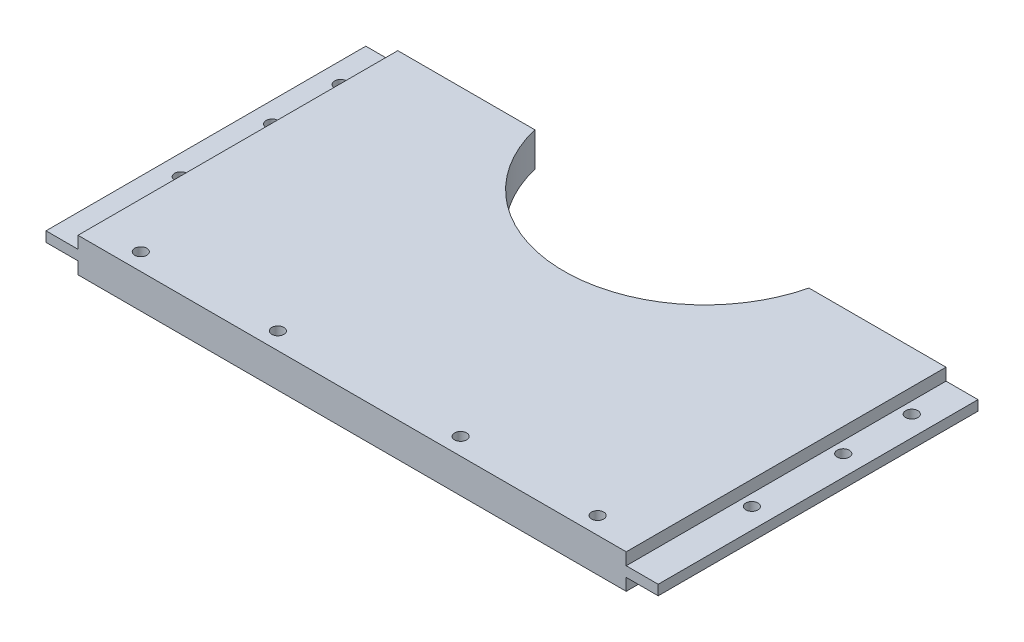
ISO-10303-21;
HEADER;
FILE_DESCRIPTION(('STEP AP214'),'2;1');
FILE_NAME('part.step','',(''),(''),'','','');
FILE_SCHEMA(('AUTOMOTIVE_DESIGN { 1 0 10303 214 1 1 1 1 }'));
ENDSEC;
DATA;
#1=APPLICATION_CONTEXT('core data for automotive mechanical design processes');
#2=APPLICATION_PROTOCOL_DEFINITION('international standard','automotive_design',2000,#1);
#3=PRODUCT_CONTEXT('',#1,'mechanical');
#4=PRODUCT('Part','Part','',(#3));
#5=PRODUCT_RELATED_PRODUCT_CATEGORY('part','',(#4));
#6=PRODUCT_DEFINITION_FORMATION('','',#4);
#7=PRODUCT_DEFINITION_CONTEXT('part definition',#1,'design');
#8=PRODUCT_DEFINITION('design','',#6,#7);
#9=PRODUCT_DEFINITION_SHAPE('','',#8);
#10=(LENGTH_UNIT() NAMED_UNIT(*) SI_UNIT(.MILLI.,.METRE.));
#11=(NAMED_UNIT(*) PLANE_ANGLE_UNIT() SI_UNIT($,.RADIAN.));
#12=(NAMED_UNIT(*) SI_UNIT($,.STERADIAN.) SOLID_ANGLE_UNIT());
#13=UNCERTAINTY_MEASURE_WITH_UNIT(LENGTH_MEASURE(1.E-05),#10,'distance_accuracy_value','');
#14=(GEOMETRIC_REPRESENTATION_CONTEXT(3) GLOBAL_UNCERTAINTY_ASSIGNED_CONTEXT((#13)) GLOBAL_UNIT_ASSIGNED_CONTEXT((#10,
#11,#12)) REPRESENTATION_CONTEXT('',''));
#15=CARTESIAN_POINT('',(0.,0.,0.));
#16=DIRECTION('',(0.,0.,1.));
#17=DIRECTION('',(1.,0.,0.));
#18=AXIS2_PLACEMENT_3D('',#15,#16,#17);
#19=CARTESIAN_POINT('',(152.4,9.525,0.));
#20=DIRECTION('',(-1.,0.,0.));
#21=DIRECTION('',(0.,0.,1.));
#22=AXIS2_PLACEMENT_3D('',#19,#20,#21);
#23=PLANE('',#22);
#24=DIRECTION('',(0.,0.,1.));
#25=VECTOR('',#24,1.);
#26=CARTESIAN_POINT('',(152.4,2.794,-88.9));
#27=LINE('',#26,#25);
#28=CARTESIAN_POINT('',(152.4,2.794,-88.9));
#29=VERTEX_POINT('',#28);
#30=CARTESIAN_POINT('',(152.4,2.794,88.8999999999999));
#31=VERTEX_POINT('',#30);
#32=EDGE_CURVE('E142',#29,#31,#27,.T.);
#33=ORIENTED_EDGE('',*,*,#32,.F.);
#34=DIRECTION('',(0.,-1.,0.));
#35=VECTOR('',#34,1.);
#36=CARTESIAN_POINT('',(152.4,9.525,-88.9));
#37=LINE('',#36,#35);
#38=CARTESIAN_POINT('',(152.4,9.525,-88.9));
#39=VERTEX_POINT('',#38);
#40=EDGE_CURVE('E272',#39,#29,#37,.T.);
#41=ORIENTED_EDGE('',*,*,#40,.F.);
#42=DIRECTION('',(0.,0.,-1.));
#43=VECTOR('',#42,1.);
#44=CARTESIAN_POINT('',(152.4,9.525,0.));
#45=LINE('',#44,#43);
#46=CARTESIAN_POINT('',(152.4,9.525,88.9));
#47=VERTEX_POINT('',#46);
#48=EDGE_CURVE('E144',#47,#39,#45,.T.);
#49=ORIENTED_EDGE('',*,*,#48,.F.);
#50=DIRECTION('',(0.,-1.,0.));
#51=VECTOR('',#50,1.);
#52=CARTESIAN_POINT('',(152.4,9.525,88.9));
#53=LINE('',#52,#51);
#54=EDGE_CURVE('E138',#47,#31,#53,.T.);
#55=ORIENTED_EDGE('',*,*,#54,.T.);
#56=EDGE_LOOP('',(#33,#41,#49,#55));
#57=FACE_BOUND('',#56,.T.);
#58=ADVANCED_FACE('F38',(#57),#23,.F.);
#59=CARTESIAN_POINT('',(-152.4,9.525,0.));
#60=DIRECTION('',(1.,0.,0.));
#61=DIRECTION('',(0.,0.,-1.));
#62=AXIS2_PLACEMENT_3D('',#59,#60,#61);
#63=PLANE('',#62);
#64=DIRECTION('',(0.,0.,-1.));
#65=VECTOR('',#64,1.);
#66=CARTESIAN_POINT('',(-152.4,2.794,-88.9));
#67=LINE('',#66,#65);
#68=CARTESIAN_POINT('',(-152.4,2.794,88.9));
#69=VERTEX_POINT('',#68);
#70=CARTESIAN_POINT('',(-152.4,2.794,-88.9));
#71=VERTEX_POINT('',#70);
#72=EDGE_CURVE('E194',#69,#71,#67,.T.);
#73=ORIENTED_EDGE('',*,*,#72,.F.);
#74=DIRECTION('',(0.,-1.,0.));
#75=VECTOR('',#74,1.);
#76=CARTESIAN_POINT('',(-152.4,9.525,88.9));
#77=LINE('',#76,#75);
#78=CARTESIAN_POINT('',(-152.4,9.525,88.9));
#79=VERTEX_POINT('',#78);
#80=EDGE_CURVE('E275',#79,#69,#77,.T.);
#81=ORIENTED_EDGE('',*,*,#80,.F.);
#82=DIRECTION('',(0.,0.,1.));
#83=VECTOR('',#82,1.);
#84=CARTESIAN_POINT('',(-152.4,9.525,0.));
#85=LINE('',#84,#83);
#86=CARTESIAN_POINT('',(-152.4,9.525,-88.9));
#87=VERTEX_POINT('',#86);
#88=EDGE_CURVE('E238',#87,#79,#85,.T.);
#89=ORIENTED_EDGE('',*,*,#88,.F.);
#90=DIRECTION('',(0.,-1.,0.));
#91=VECTOR('',#90,1.);
#92=CARTESIAN_POINT('',(-152.4,9.525,-88.9));
#93=LINE('',#92,#91);
#94=EDGE_CURVE('E47',#87,#71,#93,.T.);
#95=ORIENTED_EDGE('',*,*,#94,.T.);
#96=EDGE_LOOP('',(#73,#81,#89,#95));
#97=FACE_BOUND('',#96,.T.);
#98=ADVANCED_FACE('F325',(#97),#63,.F.);
#99=CARTESIAN_POINT('',(0.,9.525,-107.26510662425));
#100=DIRECTION('',(0.,-1.,0.));
#101=DIRECTION('',(0.,0.,-1.));
#102=AXIS2_PLACEMENT_3D('',#99,#100,#101);
#103=CYLINDRICAL_SURFACE('',#102,78.3818674268486);
#104=CARTESIAN_POINT('',(0.,-9.525,-107.26510662425));
#105=DIRECTION('',(0.,1.,0.));
#106=DIRECTION('',(0.,0.,1.));
#107=AXIS2_PLACEMENT_3D('',#104,#105,#106);
#108=CIRCLE('',#107,78.3818674268486);
#109=CARTESIAN_POINT('',(-76.2,-9.525,-88.9));
#110=VERTEX_POINT('',#109);
#111=CARTESIAN_POINT('',(76.2,-9.525,-88.9));
#112=VERTEX_POINT('',#111);
#113=EDGE_CURVE('E228',#110,#112,#108,.T.);
#114=ORIENTED_EDGE('',*,*,#113,.F.);
#115=DIRECTION('',(0.,-1.,0.));
#116=VECTOR('',#115,1.);
#117=CARTESIAN_POINT('',(-76.2,9.525,-88.9));
#118=LINE('',#117,#116);
#119=CARTESIAN_POINT('',(-76.2,9.525,-88.9));
#120=VERTEX_POINT('',#119);
#121=EDGE_CURVE('E11',#120,#110,#118,.T.);
#122=ORIENTED_EDGE('',*,*,#121,.F.);
#123=CARTESIAN_POINT('',(0.,9.525,-107.26510662425));
#124=DIRECTION('',(0.,1.,0.));
#125=DIRECTION('',(0.,0.,1.));
#126=AXIS2_PLACEMENT_3D('',#123,#124,#125);
#127=CIRCLE('',#126,78.3818674268486);
#128=CARTESIAN_POINT('',(76.2,9.525,-88.9));
#129=VERTEX_POINT('',#128);
#130=EDGE_CURVE('E229',#120,#129,#127,.T.);
#131=ORIENTED_EDGE('',*,*,#130,.T.);
#132=DIRECTION('',(0.,-1.,0.));
#133=VECTOR('',#132,1.);
#134=CARTESIAN_POINT('',(76.2,9.525,-88.9));
#135=LINE('',#134,#133);
#136=EDGE_CURVE('E249',#129,#112,#135,.T.);
#137=ORIENTED_EDGE('',*,*,#136,.T.);
#138=EDGE_LOOP('',(#114,#122,#131,#137));
#139=FACE_BOUND('',#138,.T.);
#140=ADVANCED_FACE('F40',(#139),#103,.F.);
#141=CARTESIAN_POINT('',(0.,9.525,-88.9));
#142=DIRECTION('',(0.,0.,-1.));
#143=DIRECTION('',(-1.,0.,0.));
#144=AXIS2_PLACEMENT_3D('',#141,#142,#143);
#145=PLANE('',#144);
#146=DIRECTION('',(1.,0.,0.));
#147=VECTOR('',#146,1.);
#148=CARTESIAN_POINT('',(0.,-9.525,-88.9));
#149=LINE('',#148,#147);
#150=CARTESIAN_POINT('',(-152.4,-9.525,-88.9));
#151=VERTEX_POINT('',#150);
#152=EDGE_CURVE('E253',#151,#110,#149,.T.);
#153=ORIENTED_EDGE('',*,*,#152,.F.);
#154=CARTESIAN_POINT('',(-152.4,-2.794,-88.9));
#155=VERTEX_POINT('',#154);
#156=EDGE_CURVE('E278',#155,#151,#93,.T.);
#157=ORIENTED_EDGE('',*,*,#156,.F.);
#158=DIRECTION('',(-1.,0.,0.));
#159=VECTOR('',#158,1.);
#160=CARTESIAN_POINT('',(-152.4,-2.794,-88.9));
#161=LINE('',#160,#159);
#162=CARTESIAN_POINT('',(-170.18,-2.794,-88.9));
#163=VERTEX_POINT('',#162);
#164=EDGE_CURVE('E212',#155,#163,#161,.T.);
#165=ORIENTED_EDGE('',*,*,#164,.T.);
#166=DIRECTION('',(0.,-1.,0.));
#167=VECTOR('',#166,1.);
#168=CARTESIAN_POINT('',(-170.18,2.794,-88.9));
#169=LINE('',#168,#167);
#170=CARTESIAN_POINT('',(-170.18,2.794,-88.9));
#171=VERTEX_POINT('',#170);
#172=EDGE_CURVE('E224',#171,#163,#169,.T.);
#173=ORIENTED_EDGE('',*,*,#172,.F.);
#174=DIRECTION('',(-1.,0.,0.));
#175=VECTOR('',#174,1.);
#176=CARTESIAN_POINT('',(-152.4,2.794,-88.9));
#177=LINE('',#176,#175);
#178=EDGE_CURVE('E198',#71,#171,#177,.T.);
#179=ORIENTED_EDGE('',*,*,#178,.F.);
#180=ORIENTED_EDGE('',*,*,#94,.F.);
#181=DIRECTION('',(1.,0.,0.));
#182=VECTOR('',#181,1.);
#183=CARTESIAN_POINT('',(0.,9.525,-88.9));
#184=LINE('',#183,#182);
#185=EDGE_CURVE('E233',#87,#120,#184,.T.);
#186=ORIENTED_EDGE('',*,*,#185,.T.);
#187=ORIENTED_EDGE('',*,*,#121,.T.);
#188=EDGE_LOOP('',(#153,#157,#165,#173,#179,#180,#186,#187));
#189=FACE_BOUND('',#188,.T.);
#190=ADVANCED_FACE('F296',(#189),#145,.T.);
#191=CARTESIAN_POINT('',(-152.4,-2.794,88.9));
#192=VERTEX_POINT('',#191);
#193=CARTESIAN_POINT('',(-152.4,-9.525,88.9));
#194=VERTEX_POINT('',#193);
#195=EDGE_CURVE('E148',#192,#194,#77,.T.);
#196=ORIENTED_EDGE('',*,*,#195,.F.);
#197=DIRECTION('',(0.,0.,-1.));
#198=VECTOR('',#197,1.);
#199=CARTESIAN_POINT('',(-152.4,-2.794,-88.9));
#200=LINE('',#199,#198);
#201=EDGE_CURVE('E193',#192,#155,#200,.T.);
#202=ORIENTED_EDGE('',*,*,#201,.T.);
#203=ORIENTED_EDGE('',*,*,#156,.T.);
#204=DIRECTION('',(0.,0.,1.));
#205=VECTOR('',#204,1.);
#206=CARTESIAN_POINT('',(-152.4,-9.525,0.));
#207=LINE('',#206,#205);
#208=EDGE_CURVE('E257',#151,#194,#207,.T.);
#209=ORIENTED_EDGE('',*,*,#208,.T.);
#210=EDGE_LOOP('',(#196,#202,#203,#209));
#211=FACE_BOUND('',#210,.T.);
#212=ADVANCED_FACE('F287',(#211),#63,.F.);
#213=CARTESIAN_POINT('',(0.,9.525,88.9));
#214=DIRECTION('',(0.,0.,-1.));
#215=DIRECTION('',(-1.,0.,0.));
#216=AXIS2_PLACEMENT_3D('',#213,#214,#215);
#217=PLANE('',#216);
#218=DIRECTION('',(1.,0.,0.));
#219=VECTOR('',#218,1.);
#220=CARTESIAN_POINT('',(0.,-9.525,88.9));
#221=LINE('',#220,#219);
#222=CARTESIAN_POINT('',(152.4,-9.525,88.9));
#223=VERTEX_POINT('',#222);
#224=EDGE_CURVE('E261',#194,#223,#221,.T.);
#225=ORIENTED_EDGE('',*,*,#224,.T.);
#226=CARTESIAN_POINT('',(152.4,-2.794,88.9));
#227=VERTEX_POINT('',#226);
#228=EDGE_CURVE('E149',#227,#223,#53,.T.);
#229=ORIENTED_EDGE('',*,*,#228,.F.);
#230=DIRECTION('',(1.,0.,0.));
#231=VECTOR('',#230,1.);
#232=CARTESIAN_POINT('',(152.4,-2.794,88.8999999999999));
#233=LINE('',#232,#231);
#234=CARTESIAN_POINT('',(170.18,-2.794,88.8999999999999));
#235=VERTEX_POINT('',#234);
#236=EDGE_CURVE('E183',#227,#235,#233,.T.);
#237=ORIENTED_EDGE('',*,*,#236,.T.);
#238=DIRECTION('',(0.,-1.,0.));
#239=VECTOR('',#238,1.);
#240=CARTESIAN_POINT('',(170.18,2.794,88.8999999999999));
#241=LINE('',#240,#239);
#242=CARTESIAN_POINT('',(170.18,2.794,88.8999999999999));
#243=VERTEX_POINT('',#242);
#244=EDGE_CURVE('E156',#243,#235,#241,.T.);
#245=ORIENTED_EDGE('',*,*,#244,.F.);
#246=DIRECTION('',(1.,0.,0.));
#247=VECTOR('',#246,1.);
#248=CARTESIAN_POINT('',(152.4,2.794,88.8999999999999));
#249=LINE('',#248,#247);
#250=EDGE_CURVE('E152',#31,#243,#249,.T.);
#251=ORIENTED_EDGE('',*,*,#250,.F.);
#252=ORIENTED_EDGE('',*,*,#54,.F.);
#253=DIRECTION('',(1.,0.,0.));
#254=VECTOR('',#253,1.);
#255=CARTESIAN_POINT('',(0.,9.525,88.9));
#256=LINE('',#255,#254);
#257=EDGE_CURVE('E241',#79,#47,#256,.T.);
#258=ORIENTED_EDGE('',*,*,#257,.F.);
#259=ORIENTED_EDGE('',*,*,#80,.T.);
#260=DIRECTION('',(1.,0.,0.));
#261=VECTOR('',#260,1.);
#262=CARTESIAN_POINT('',(-152.4,2.794,88.9));
#263=LINE('',#262,#261);
#264=CARTESIAN_POINT('',(-170.18,2.794,88.9));
#265=VERTEX_POINT('',#264);
#266=EDGE_CURVE('E205',#265,#69,#263,.T.);
#267=ORIENTED_EDGE('',*,*,#266,.F.);
#268=DIRECTION('',(0.,-1.,0.));
#269=VECTOR('',#268,1.);
#270=CARTESIAN_POINT('',(-170.18,2.794,88.9));
#271=LINE('',#270,#269);
#272=CARTESIAN_POINT('',(-170.18,-2.794,88.9));
#273=VERTEX_POINT('',#272);
#274=EDGE_CURVE('E209',#265,#273,#271,.T.);
#275=ORIENTED_EDGE('',*,*,#274,.T.);
#276=DIRECTION('',(1.,0.,0.));
#277=VECTOR('',#276,1.);
#278=CARTESIAN_POINT('',(-152.4,-2.794,88.9));
#279=LINE('',#278,#277);
#280=EDGE_CURVE('E199',#273,#192,#279,.T.);
#281=ORIENTED_EDGE('',*,*,#280,.T.);
#282=ORIENTED_EDGE('',*,*,#195,.T.);
#283=EDGE_LOOP('',(#225,#229,#237,#245,#251,#252,#258,#259,#267,#275,#281,#282));
#284=FACE_BOUND('',#283,.T.);
#285=ADVANCED_FACE('F154',(#284),#217,.F.);
#286=CARTESIAN_POINT('',(152.4,-2.794,-88.9));
#287=VERTEX_POINT('',#286);
#288=CARTESIAN_POINT('',(152.4,-9.525,-88.9));
#289=VERTEX_POINT('',#288);
#290=EDGE_CURVE('E59',#287,#289,#37,.T.);
#291=ORIENTED_EDGE('',*,*,#290,.F.);
#292=DIRECTION('',(0.,0.,1.));
#293=VECTOR('',#292,1.);
#294=CARTESIAN_POINT('',(152.4,-2.794,-88.9));
#295=LINE('',#294,#293);
#296=EDGE_CURVE('E54',#287,#227,#295,.T.);
#297=ORIENTED_EDGE('',*,*,#296,.T.);
#298=ORIENTED_EDGE('',*,*,#228,.T.);
#299=DIRECTION('',(0.,0.,-1.));
#300=VECTOR('',#299,1.);
#301=CARTESIAN_POINT('',(152.4,-9.525,0.));
#302=LINE('',#301,#300);
#303=EDGE_CURVE('E264',#223,#289,#302,.T.);
#304=ORIENTED_EDGE('',*,*,#303,.T.);
#305=EDGE_LOOP('',(#291,#297,#298,#304));
#306=FACE_BOUND('',#305,.T.);
#307=ADVANCED_FACE('F308',(#306),#23,.F.);
#308=CARTESIAN_POINT('',(0.,9.525,-88.8999999999999));
#309=DIRECTION('',(0.,0.,1.));
#310=DIRECTION('',(1.,0.,0.));
#311=AXIS2_PLACEMENT_3D('',#308,#309,#310);
#312=PLANE('',#311);
#313=DIRECTION('',(-1.,0.,0.));
#314=VECTOR('',#313,1.);
#315=CARTESIAN_POINT('',(0.,-9.525,-88.8999999999999));
#316=LINE('',#315,#314);
#317=EDGE_CURVE('E234',#289,#112,#316,.T.);
#318=ORIENTED_EDGE('',*,*,#317,.T.);
#319=ORIENTED_EDGE('',*,*,#136,.F.);
#320=DIRECTION('',(-1.,0.,0.));
#321=VECTOR('',#320,1.);
#322=CARTESIAN_POINT('',(0.,9.525,-88.8999999999999));
#323=LINE('',#322,#321);
#324=EDGE_CURVE('E246',#39,#129,#323,.T.);
#325=ORIENTED_EDGE('',*,*,#324,.F.);
#326=ORIENTED_EDGE('',*,*,#40,.T.);
#327=DIRECTION('',(-1.,0.,0.));
#328=VECTOR('',#327,1.);
#329=CARTESIAN_POINT('',(152.4,2.794,-88.9));
#330=LINE('',#329,#328);
#331=CARTESIAN_POINT('',(170.18,2.794,-88.9));
#332=VERTEX_POINT('',#331);
#333=EDGE_CURVE('E165',#332,#29,#330,.T.);
#334=ORIENTED_EDGE('',*,*,#333,.F.);
#335=DIRECTION('',(0.,-1.,0.));
#336=VECTOR('',#335,1.);
#337=CARTESIAN_POINT('',(170.18,2.794,-88.9));
#338=LINE('',#337,#336);
#339=CARTESIAN_POINT('',(170.18,-2.794,-88.9));
#340=VERTEX_POINT('',#339);
#341=EDGE_CURVE('E180',#332,#340,#338,.T.);
#342=ORIENTED_EDGE('',*,*,#341,.T.);
#343=DIRECTION('',(-1.,0.,0.));
#344=VECTOR('',#343,1.);
#345=CARTESIAN_POINT('',(152.4,-2.794,-88.9));
#346=LINE('',#345,#344);
#347=EDGE_CURVE('E167',#340,#287,#346,.T.);
#348=ORIENTED_EDGE('',*,*,#347,.T.);
#349=ORIENTED_EDGE('',*,*,#290,.T.);
#350=EDGE_LOOP('',(#318,#319,#325,#326,#334,#342,#348,#349));
#351=FACE_BOUND('',#350,.T.);
#352=ADVANCED_FACE('F304',(#351),#312,.F.);
#353=CARTESIAN_POINT('',(0.,9.525,0.));
#354=DIRECTION('',(0.,1.,0.));
#355=DIRECTION('',(0.,0.,1.));
#356=AXIS2_PLACEMENT_3D('',#353,#354,#355);
#357=PLANE('',#356);
#358=CARTESIAN_POINT('',(127.,9.525,79.375));
#359=DIRECTION('',(0.,1.,0.));
#360=DIRECTION('',(0.,0.,1.));
#361=AXIS2_PLACEMENT_3D('',#358,#359,#360);
#362=CIRCLE('',#361,3.3782);
#363=CARTESIAN_POINT('',(127.,9.525,82.7532));
#364=VERTEX_POINT('',#363);
#365=EDGE_CURVE('E558',#364,#364,#362,.T.);
#366=ORIENTED_EDGE('',*,*,#365,.F.);
#367=EDGE_LOOP('',(#366));
#368=FACE_BOUND('',#367,.T.);
#369=CARTESIAN_POINT('',(50.8,9.525,79.375));
#370=DIRECTION('',(0.,1.,0.));
#371=DIRECTION('',(0.,0.,1.));
#372=AXIS2_PLACEMENT_3D('',#369,#370,#371);
#373=CIRCLE('',#372,3.37819999999998);
#374=CARTESIAN_POINT('',(50.8,9.525,82.7531999999999));
#375=VERTEX_POINT('',#374);
#376=EDGE_CURVE('E562',#375,#375,#373,.T.);
#377=ORIENTED_EDGE('',*,*,#376,.F.);
#378=EDGE_LOOP('',(#377));
#379=FACE_BOUND('',#378,.T.);
#380=CARTESIAN_POINT('',(-127.,9.525,79.375));
#381=DIRECTION('',(0.,1.,0.));
#382=DIRECTION('',(0.,0.,1.));
#383=AXIS2_PLACEMENT_3D('',#380,#381,#382);
#384=CIRCLE('',#383,3.37819999999998);
#385=CARTESIAN_POINT('',(-127.,9.525,82.7531999999999));
#386=VERTEX_POINT('',#385);
#387=EDGE_CURVE('E572',#386,#386,#384,.T.);
#388=ORIENTED_EDGE('',*,*,#387,.F.);
#389=EDGE_LOOP('',(#388));
#390=FACE_BOUND('',#389,.T.);
#391=CARTESIAN_POINT('',(-50.8,9.525,79.375));
#392=DIRECTION('',(0.,1.,0.));
#393=DIRECTION('',(0.,0.,1.));
#394=AXIS2_PLACEMENT_3D('',#391,#392,#393);
#395=CIRCLE('',#394,3.37819999999998);
#396=CARTESIAN_POINT('',(-50.8,9.525,82.7531999999999));
#397=VERTEX_POINT('',#396);
#398=EDGE_CURVE('E580',#397,#397,#395,.T.);
#399=ORIENTED_EDGE('',*,*,#398,.F.);
#400=EDGE_LOOP('',(#399));
#401=FACE_BOUND('',#400,.T.);
#402=ORIENTED_EDGE('',*,*,#130,.F.);
#403=ORIENTED_EDGE('',*,*,#185,.F.);
#404=ORIENTED_EDGE('',*,*,#88,.T.);
#405=ORIENTED_EDGE('',*,*,#257,.T.);
#406=ORIENTED_EDGE('',*,*,#48,.T.);
#407=ORIENTED_EDGE('',*,*,#324,.T.);
#408=EDGE_LOOP('',(#402,#403,#404,#405,#406,#407));
#409=FACE_BOUND('',#408,.T.);
#410=ADVANCED_FACE('F327',(#368,#379,#390,#401,#409),#357,.T.);
#411=CARTESIAN_POINT('',(0.,-9.525,0.));
#412=DIRECTION('',(0.,1.,0.));
#413=DIRECTION('',(0.,0.,1.));
#414=AXIS2_PLACEMENT_3D('',#411,#412,#413);
#415=PLANE('',#414);
#416=CARTESIAN_POINT('',(127.,-9.525,79.375));
#417=DIRECTION('',(0.,1.,0.));
#418=DIRECTION('',(0.,0.,1.));
#419=AXIS2_PLACEMENT_3D('',#416,#417,#418);
#420=CIRCLE('',#419,3.3782);
#421=CARTESIAN_POINT('',(127.,-9.525,82.7532));
#422=VERTEX_POINT('',#421);
#423=EDGE_CURVE('E555',#422,#422,#420,.T.);
#424=ORIENTED_EDGE('',*,*,#423,.T.);
#425=EDGE_LOOP('',(#424));
#426=FACE_BOUND('',#425,.T.);
#427=CARTESIAN_POINT('',(50.8,-9.525,79.375));
#428=DIRECTION('',(0.,1.,0.));
#429=DIRECTION('',(0.,0.,1.));
#430=AXIS2_PLACEMENT_3D('',#427,#428,#429);
#431=CIRCLE('',#430,3.37819999999999);
#432=CARTESIAN_POINT('',(50.8,-9.525,82.7531999999999));
#433=VERTEX_POINT('',#432);
#434=EDGE_CURVE('E568',#433,#433,#431,.T.);
#435=ORIENTED_EDGE('',*,*,#434,.T.);
#436=EDGE_LOOP('',(#435));
#437=FACE_BOUND('',#436,.T.);
#438=CARTESIAN_POINT('',(-127.,-9.525,79.375));
#439=DIRECTION('',(0.,1.,0.));
#440=DIRECTION('',(0.,0.,1.));
#441=AXIS2_PLACEMENT_3D('',#438,#439,#440);
#442=CIRCLE('',#441,3.37819999999999);
#443=CARTESIAN_POINT('',(-127.,-9.525,82.7531999999999));
#444=VERTEX_POINT('',#443);
#445=EDGE_CURVE('E576',#444,#444,#442,.T.);
#446=ORIENTED_EDGE('',*,*,#445,.T.);
#447=EDGE_LOOP('',(#446));
#448=FACE_BOUND('',#447,.T.);
#449=CARTESIAN_POINT('',(-50.8,-9.525,79.375));
#450=DIRECTION('',(0.,1.,0.));
#451=DIRECTION('',(0.,0.,1.));
#452=AXIS2_PLACEMENT_3D('',#449,#450,#451);
#453=CIRCLE('',#452,3.37819999999999);
#454=CARTESIAN_POINT('',(-50.8,-9.525,82.7531999999999));
#455=VERTEX_POINT('',#454);
#456=EDGE_CURVE('E584',#455,#455,#453,.T.);
#457=ORIENTED_EDGE('',*,*,#456,.T.);
#458=EDGE_LOOP('',(#457));
#459=FACE_BOUND('',#458,.T.);
#460=ORIENTED_EDGE('',*,*,#113,.T.);
#461=ORIENTED_EDGE('',*,*,#317,.F.);
#462=ORIENTED_EDGE('',*,*,#303,.F.);
#463=ORIENTED_EDGE('',*,*,#224,.F.);
#464=ORIENTED_EDGE('',*,*,#208,.F.);
#465=ORIENTED_EDGE('',*,*,#152,.T.);
#466=EDGE_LOOP('',(#460,#461,#462,#463,#464,#465));
#467=FACE_BOUND('',#466,.T.);
#468=ADVANCED_FACE('F294',(#426,#437,#448,#459,#467),#415,.F.);
#469=CARTESIAN_POINT('',(-170.18,2.794,-88.9));
#470=DIRECTION('',(1.,0.,0.));
#471=DIRECTION('',(0.,0.,-1.));
#472=AXIS2_PLACEMENT_3D('',#469,#470,#471);
#473=PLANE('',#472);
#474=DIRECTION('',(0.,0.,1.));
#475=VECTOR('',#474,1.);
#476=CARTESIAN_POINT('',(-170.18,-2.794,-88.9));
#477=LINE('',#476,#475);
#478=EDGE_CURVE('E215',#163,#273,#477,.T.);
#479=ORIENTED_EDGE('',*,*,#478,.T.);
#480=ORIENTED_EDGE('',*,*,#274,.F.);
#481=DIRECTION('',(0.,0.,1.));
#482=VECTOR('',#481,1.);
#483=CARTESIAN_POINT('',(-170.18,2.794,-88.9));
#484=LINE('',#483,#482);
#485=EDGE_CURVE('E202',#171,#265,#484,.T.);
#486=ORIENTED_EDGE('',*,*,#485,.F.);
#487=ORIENTED_EDGE('',*,*,#172,.T.);
#488=EDGE_LOOP('',(#479,#480,#486,#487));
#489=FACE_BOUND('',#488,.T.);
#490=ADVANCED_FACE('F321',(#489),#473,.F.);
#491=CARTESIAN_POINT('',(0.,2.794,0.));
#492=DIRECTION('',(0.,-1.,0.));
#493=DIRECTION('',(0.,0.,-1.));
#494=AXIS2_PLACEMENT_3D('',#491,#492,#493);
#495=PLANE('',#494);
#496=CARTESIAN_POINT('',(-158.75,2.794,-63.5));
#497=DIRECTION('',(0.,1.,0.));
#498=DIRECTION('',(0.,0.,1.));
#499=AXIS2_PLACEMENT_3D('',#496,#497,#498);
#500=CIRCLE('',#499,3.3782);
#501=CARTESIAN_POINT('',(-158.75,2.794,-60.1218));
#502=VERTEX_POINT('',#501);
#503=EDGE_CURVE('E588',#502,#502,#500,.T.);
#504=ORIENTED_EDGE('',*,*,#503,.F.);
#505=EDGE_LOOP('',(#504));
#506=FACE_BOUND('',#505,.T.);
#507=CARTESIAN_POINT('',(-158.75,2.794,-25.4));
#508=DIRECTION('',(0.,1.,0.));
#509=DIRECTION('',(0.,0.,1.));
#510=AXIS2_PLACEMENT_3D('',#507,#508,#509);
#511=CIRCLE('',#510,3.3782);
#512=CARTESIAN_POINT('',(-158.75,2.794,-22.0218));
#513=VERTEX_POINT('',#512);
#514=EDGE_CURVE('E596',#513,#513,#511,.T.);
#515=ORIENTED_EDGE('',*,*,#514,.F.);
#516=EDGE_LOOP('',(#515));
#517=FACE_BOUND('',#516,.T.);
#518=CARTESIAN_POINT('',(-158.75,2.794,25.4));
#519=DIRECTION('',(0.,1.,0.));
#520=DIRECTION('',(0.,0.,1.));
#521=AXIS2_PLACEMENT_3D('',#518,#519,#520);
#522=CIRCLE('',#521,3.3782);
#523=CARTESIAN_POINT('',(-158.75,2.794,28.7782));
#524=VERTEX_POINT('',#523);
#525=EDGE_CURVE('E604',#524,#524,#522,.T.);
#526=ORIENTED_EDGE('',*,*,#525,.F.);
#527=EDGE_LOOP('',(#526));
#528=FACE_BOUND('',#527,.T.);
#529=ORIENTED_EDGE('',*,*,#72,.T.);
#530=ORIENTED_EDGE('',*,*,#178,.T.);
#531=ORIENTED_EDGE('',*,*,#485,.T.);
#532=ORIENTED_EDGE('',*,*,#266,.T.);
#533=EDGE_LOOP('',(#529,#530,#531,#532));
#534=FACE_BOUND('',#533,.T.);
#535=ADVANCED_FACE('F323',(#506,#517,#528,#534),#495,.F.);
#536=CARTESIAN_POINT('',(0.,-2.794,0.));
#537=DIRECTION('',(0.,-1.,0.));
#538=DIRECTION('',(0.,0.,-1.));
#539=AXIS2_PLACEMENT_3D('',#536,#537,#538);
#540=PLANE('',#539);
#541=CARTESIAN_POINT('',(-158.75,-2.794,-63.5));
#542=DIRECTION('',(0.,-1.,0.));
#543=DIRECTION('',(0.,0.,-1.));
#544=AXIS2_PLACEMENT_3D('',#541,#542,#543);
#545=CIRCLE('',#544,3.3782);
#546=CARTESIAN_POINT('',(-158.75,-2.794,-66.8782));
#547=VERTEX_POINT('',#546);
#548=EDGE_CURVE('E592',#547,#547,#545,.T.);
#549=ORIENTED_EDGE('',*,*,#548,.F.);
#550=EDGE_LOOP('',(#549));
#551=FACE_BOUND('',#550,.T.);
#552=CARTESIAN_POINT('',(-158.75,-2.794,-25.4));
#553=DIRECTION('',(0.,-1.,0.));
#554=DIRECTION('',(0.,0.,-1.));
#555=AXIS2_PLACEMENT_3D('',#552,#553,#554);
#556=CIRCLE('',#555,3.3782);
#557=CARTESIAN_POINT('',(-158.75,-2.794,-28.7782));
#558=VERTEX_POINT('',#557);
#559=EDGE_CURVE('E600',#558,#558,#556,.T.);
#560=ORIENTED_EDGE('',*,*,#559,.F.);
#561=EDGE_LOOP('',(#560));
#562=FACE_BOUND('',#561,.T.);
#563=CARTESIAN_POINT('',(-158.75,-2.794,25.4));
#564=DIRECTION('',(0.,-1.,0.));
#565=DIRECTION('',(0.,0.,-1.));
#566=AXIS2_PLACEMENT_3D('',#563,#564,#565);
#567=CIRCLE('',#566,3.3782);
#568=CARTESIAN_POINT('',(-158.75,-2.794,22.0218));
#569=VERTEX_POINT('',#568);
#570=EDGE_CURVE('E608',#569,#569,#567,.T.);
#571=ORIENTED_EDGE('',*,*,#570,.F.);
#572=EDGE_LOOP('',(#571));
#573=FACE_BOUND('',#572,.T.);
#574=ORIENTED_EDGE('',*,*,#201,.F.);
#575=ORIENTED_EDGE('',*,*,#280,.F.);
#576=ORIENTED_EDGE('',*,*,#478,.F.);
#577=ORIENTED_EDGE('',*,*,#164,.F.);
#578=EDGE_LOOP('',(#574,#575,#576,#577));
#579=FACE_BOUND('',#578,.T.);
#580=ADVANCED_FACE('F317',(#551,#562,#573,#579),#540,.T.);
#581=CARTESIAN_POINT('',(170.18,2.794,-88.9));
#582=DIRECTION('',(-1.,0.,0.));
#583=DIRECTION('',(0.,0.,1.));
#584=AXIS2_PLACEMENT_3D('',#581,#582,#583);
#585=PLANE('',#584);
#586=DIRECTION('',(0.,0.,-1.));
#587=VECTOR('',#586,1.);
#588=CARTESIAN_POINT('',(170.18,-2.794,-88.9));
#589=LINE('',#588,#587);
#590=EDGE_CURVE('E170',#235,#340,#589,.T.);
#591=ORIENTED_EDGE('',*,*,#590,.T.);
#592=ORIENTED_EDGE('',*,*,#341,.F.);
#593=DIRECTION('',(0.,0.,-1.));
#594=VECTOR('',#593,1.);
#595=CARTESIAN_POINT('',(170.18,2.794,-88.9));
#596=LINE('',#595,#594);
#597=EDGE_CURVE('E160',#243,#332,#596,.T.);
#598=ORIENTED_EDGE('',*,*,#597,.F.);
#599=ORIENTED_EDGE('',*,*,#244,.T.);
#600=EDGE_LOOP('',(#591,#592,#598,#599));
#601=FACE_BOUND('',#600,.T.);
#602=ADVANCED_FACE('F333',(#601),#585,.F.);
#603=CARTESIAN_POINT('',(0.,2.794,0.));
#604=DIRECTION('',(0.,1.,0.));
#605=DIRECTION('',(0.,0.,1.));
#606=AXIS2_PLACEMENT_3D('',#603,#604,#605);
#607=PLANE('',#606);
#608=CARTESIAN_POINT('',(158.75,2.794,-63.5));
#609=DIRECTION('',(0.,1.,0.));
#610=DIRECTION('',(0.,0.,1.));
#611=AXIS2_PLACEMENT_3D('',#608,#609,#610);
#612=CIRCLE('',#611,3.3782);
#613=CARTESIAN_POINT('',(158.75,2.794,-60.1218));
#614=VERTEX_POINT('',#613);
#615=EDGE_CURVE('E612',#614,#614,#612,.T.);
#616=ORIENTED_EDGE('',*,*,#615,.F.);
#617=EDGE_LOOP('',(#616));
#618=FACE_BOUND('',#617,.T.);
#619=CARTESIAN_POINT('',(158.75,2.794,-25.4));
#620=DIRECTION('',(0.,1.,0.));
#621=DIRECTION('',(0.,0.,1.));
#622=AXIS2_PLACEMENT_3D('',#619,#620,#621);
#623=CIRCLE('',#622,3.3782);
#624=CARTESIAN_POINT('',(158.75,2.794,-22.0218));
#625=VERTEX_POINT('',#624);
#626=EDGE_CURVE('E620',#625,#625,#623,.T.);
#627=ORIENTED_EDGE('',*,*,#626,.F.);
#628=EDGE_LOOP('',(#627));
#629=FACE_BOUND('',#628,.T.);
#630=CARTESIAN_POINT('',(158.75,2.794,25.4));
#631=DIRECTION('',(0.,1.,0.));
#632=DIRECTION('',(0.,0.,1.));
#633=AXIS2_PLACEMENT_3D('',#630,#631,#632);
#634=CIRCLE('',#633,3.3782);
#635=CARTESIAN_POINT('',(158.75,2.794,28.7782));
#636=VERTEX_POINT('',#635);
#637=EDGE_CURVE('E627',#636,#636,#634,.T.);
#638=ORIENTED_EDGE('',*,*,#637,.F.);
#639=EDGE_LOOP('',(#638));
#640=FACE_BOUND('',#639,.T.);
#641=ORIENTED_EDGE('',*,*,#32,.T.);
#642=ORIENTED_EDGE('',*,*,#250,.T.);
#643=ORIENTED_EDGE('',*,*,#597,.T.);
#644=ORIENTED_EDGE('',*,*,#333,.T.);
#645=EDGE_LOOP('',(#641,#642,#643,#644));
#646=FACE_BOUND('',#645,.T.);
#647=ADVANCED_FACE('F163',(#618,#629,#640,#646),#607,.T.);
#648=CARTESIAN_POINT('',(0.,-2.794,0.));
#649=DIRECTION('',(0.,1.,0.));
#650=DIRECTION('',(0.,0.,1.));
#651=AXIS2_PLACEMENT_3D('',#648,#649,#650);
#652=PLANE('',#651);
#653=CARTESIAN_POINT('',(158.75,-2.794,-63.5));
#654=DIRECTION('',(0.,1.,0.));
#655=DIRECTION('',(0.,0.,1.));
#656=AXIS2_PLACEMENT_3D('',#653,#654,#655);
#657=CIRCLE('',#656,3.3782);
#658=CARTESIAN_POINT('',(158.75,-2.794,-60.1218));
#659=VERTEX_POINT('',#658);
#660=EDGE_CURVE('E616',#659,#659,#657,.T.);
#661=ORIENTED_EDGE('',*,*,#660,.T.);
#662=EDGE_LOOP('',(#661));
#663=FACE_BOUND('',#662,.T.);
#664=CARTESIAN_POINT('',(158.75,-2.794,-25.4));
#665=DIRECTION('',(0.,1.,0.));
#666=DIRECTION('',(0.,0.,1.));
#667=AXIS2_PLACEMENT_3D('',#664,#665,#666);
#668=CIRCLE('',#667,3.3782);
#669=CARTESIAN_POINT('',(158.75,-2.794,-22.0218));
#670=VERTEX_POINT('',#669);
#671=EDGE_CURVE('E624',#670,#670,#668,.T.);
#672=ORIENTED_EDGE('',*,*,#671,.T.);
#673=EDGE_LOOP('',(#672));
#674=FACE_BOUND('',#673,.T.);
#675=CARTESIAN_POINT('',(158.75,-2.794,25.4));
#676=DIRECTION('',(0.,1.,0.));
#677=DIRECTION('',(0.,0.,1.));
#678=AXIS2_PLACEMENT_3D('',#675,#676,#677);
#679=CIRCLE('',#678,3.3782);
#680=CARTESIAN_POINT('',(158.75,-2.794,28.7782));
#681=VERTEX_POINT('',#680);
#682=EDGE_CURVE('E173',#681,#681,#679,.T.);
#683=ORIENTED_EDGE('',*,*,#682,.T.);
#684=EDGE_LOOP('',(#683));
#685=FACE_BOUND('',#684,.T.);
#686=ORIENTED_EDGE('',*,*,#296,.F.);
#687=ORIENTED_EDGE('',*,*,#347,.F.);
#688=ORIENTED_EDGE('',*,*,#590,.F.);
#689=ORIENTED_EDGE('',*,*,#236,.F.);
#690=EDGE_LOOP('',(#686,#687,#688,#689));
#691=FACE_BOUND('',#690,.T.);
#692=ADVANCED_FACE('F332',(#663,#674,#685,#691),#652,.F.);
#693=CARTESIAN_POINT('',(158.75,2.794,25.4));
#694=DIRECTION('',(0.,1.,0.));
#695=DIRECTION('',(0.,0.,1.));
#696=AXIS2_PLACEMENT_3D('',#693,#694,#695);
#697=CYLINDRICAL_SURFACE('',#696,3.3782);
#698=ORIENTED_EDGE('',*,*,#682,.F.);
#699=EDGE_LOOP('',(#698));
#700=FACE_BOUND('',#699,.T.);
#701=ORIENTED_EDGE('',*,*,#637,.T.);
#702=EDGE_LOOP('',(#701));
#703=FACE_BOUND('',#702,.T.);
#704=ADVANCED_FACE('F433',(#700,#703),#697,.F.);
#705=CARTESIAN_POINT('',(158.75,2.794,-25.4));
#706=DIRECTION('',(0.,1.,0.));
#707=DIRECTION('',(0.,0.,1.));
#708=AXIS2_PLACEMENT_3D('',#705,#706,#707);
#709=CYLINDRICAL_SURFACE('',#708,3.3782);
#710=ORIENTED_EDGE('',*,*,#671,.F.);
#711=EDGE_LOOP('',(#710));
#712=FACE_BOUND('',#711,.T.);
#713=ORIENTED_EDGE('',*,*,#626,.T.);
#714=EDGE_LOOP('',(#713));
#715=FACE_BOUND('',#714,.T.);
#716=ADVANCED_FACE('F441',(#712,#715),#709,.F.);
#717=CARTESIAN_POINT('',(158.75,2.794,-63.5));
#718=DIRECTION('',(0.,1.,0.));
#719=DIRECTION('',(0.,0.,1.));
#720=AXIS2_PLACEMENT_3D('',#717,#718,#719);
#721=CYLINDRICAL_SURFACE('',#720,3.3782);
#722=ORIENTED_EDGE('',*,*,#660,.F.);
#723=EDGE_LOOP('',(#722));
#724=FACE_BOUND('',#723,.T.);
#725=ORIENTED_EDGE('',*,*,#615,.T.);
#726=EDGE_LOOP('',(#725));
#727=FACE_BOUND('',#726,.T.);
#728=ADVANCED_FACE('F451',(#724,#727),#721,.F.);
#729=CARTESIAN_POINT('',(-158.75,2.794,25.4));
#730=DIRECTION('',(0.,1.,0.));
#731=DIRECTION('',(0.,0.,1.));
#732=AXIS2_PLACEMENT_3D('',#729,#730,#731);
#733=CYLINDRICAL_SURFACE('',#732,3.3782);
#734=ORIENTED_EDGE('',*,*,#525,.T.);
#735=EDGE_LOOP('',(#734));
#736=FACE_BOUND('',#735,.T.);
#737=ORIENTED_EDGE('',*,*,#570,.T.);
#738=EDGE_LOOP('',(#737));
#739=FACE_BOUND('',#738,.T.);
#740=ADVANCED_FACE('F461',(#736,#739),#733,.F.);
#741=CARTESIAN_POINT('',(-158.75,2.794,-25.4));
#742=DIRECTION('',(0.,1.,0.));
#743=DIRECTION('',(0.,0.,1.));
#744=AXIS2_PLACEMENT_3D('',#741,#742,#743);
#745=CYLINDRICAL_SURFACE('',#744,3.3782);
#746=ORIENTED_EDGE('',*,*,#514,.T.);
#747=EDGE_LOOP('',(#746));
#748=FACE_BOUND('',#747,.T.);
#749=ORIENTED_EDGE('',*,*,#559,.T.);
#750=EDGE_LOOP('',(#749));
#751=FACE_BOUND('',#750,.T.);
#752=ADVANCED_FACE('F477',(#748,#751),#745,.F.);
#753=CARTESIAN_POINT('',(-158.75,2.794,-63.5));
#754=DIRECTION('',(0.,1.,0.));
#755=DIRECTION('',(0.,0.,1.));
#756=AXIS2_PLACEMENT_3D('',#753,#754,#755);
#757=CYLINDRICAL_SURFACE('',#756,3.3782);
#758=ORIENTED_EDGE('',*,*,#503,.T.);
#759=EDGE_LOOP('',(#758));
#760=FACE_BOUND('',#759,.T.);
#761=ORIENTED_EDGE('',*,*,#548,.T.);
#762=EDGE_LOOP('',(#761));
#763=FACE_BOUND('',#762,.T.);
#764=ADVANCED_FACE('F487',(#760,#763),#757,.F.);
#765=CARTESIAN_POINT('',(-50.8,9.525,79.375));
#766=DIRECTION('',(0.,1.,0.));
#767=DIRECTION('',(0.,0.,1.));
#768=AXIS2_PLACEMENT_3D('',#765,#766,#767);
#769=CYLINDRICAL_SURFACE('',#768,3.37819999999999);
#770=ORIENTED_EDGE('',*,*,#456,.F.);
#771=EDGE_LOOP('',(#770));
#772=FACE_BOUND('',#771,.T.);
#773=ORIENTED_EDGE('',*,*,#398,.T.);
#774=EDGE_LOOP('',(#773));
#775=FACE_BOUND('',#774,.T.);
#776=ADVANCED_FACE('F497',(#772,#775),#769,.F.);
#777=CARTESIAN_POINT('',(-127.,9.525,79.375));
#778=DIRECTION('',(0.,1.,0.));
#779=DIRECTION('',(0.,0.,1.));
#780=AXIS2_PLACEMENT_3D('',#777,#778,#779);
#781=CYLINDRICAL_SURFACE('',#780,3.37819999999999);
#782=ORIENTED_EDGE('',*,*,#445,.F.);
#783=EDGE_LOOP('',(#782));
#784=FACE_BOUND('',#783,.T.);
#785=ORIENTED_EDGE('',*,*,#387,.T.);
#786=EDGE_LOOP('',(#785));
#787=FACE_BOUND('',#786,.T.);
#788=ADVANCED_FACE('F507',(#784,#787),#781,.F.);
#789=CARTESIAN_POINT('',(50.8,9.525,79.375));
#790=DIRECTION('',(0.,1.,0.));
#791=DIRECTION('',(0.,0.,1.));
#792=AXIS2_PLACEMENT_3D('',#789,#790,#791);
#793=CYLINDRICAL_SURFACE('',#792,3.37819999999999);
#794=ORIENTED_EDGE('',*,*,#434,.F.);
#795=EDGE_LOOP('',(#794));
#796=FACE_BOUND('',#795,.T.);
#797=ORIENTED_EDGE('',*,*,#376,.T.);
#798=EDGE_LOOP('',(#797));
#799=FACE_BOUND('',#798,.T.);
#800=ADVANCED_FACE('F517',(#796,#799),#793,.F.);
#801=CARTESIAN_POINT('',(127.,9.525,79.375));
#802=DIRECTION('',(0.,1.,0.));
#803=DIRECTION('',(0.,0.,1.));
#804=AXIS2_PLACEMENT_3D('',#801,#802,#803);
#805=CYLINDRICAL_SURFACE('',#804,3.3782);
#806=ORIENTED_EDGE('',*,*,#423,.F.);
#807=EDGE_LOOP('',(#806));
#808=FACE_BOUND('',#807,.T.);
#809=ORIENTED_EDGE('',*,*,#365,.T.);
#810=EDGE_LOOP('',(#809));
#811=FACE_BOUND('',#810,.T.);
#812=ADVANCED_FACE('F538',(#808,#811),#805,.F.);
#813=CLOSED_SHELL('',(#58,#98,#140,#190,#212,#285,#307,#352,#410,#468,#490,#535,#580,#602,#647,
#692,#704,#716,#728,#740,#752,#764,#776,#788,#800,#812));
#814=MANIFOLD_SOLID_BREP('B2',#813);
#815=ADVANCED_BREP_SHAPE_REPRESENTATION('',(#18,#814),#14);
#816=SHAPE_DEFINITION_REPRESENTATION(#9,#815);
ENDSEC;
END-ISO-10303-21;
